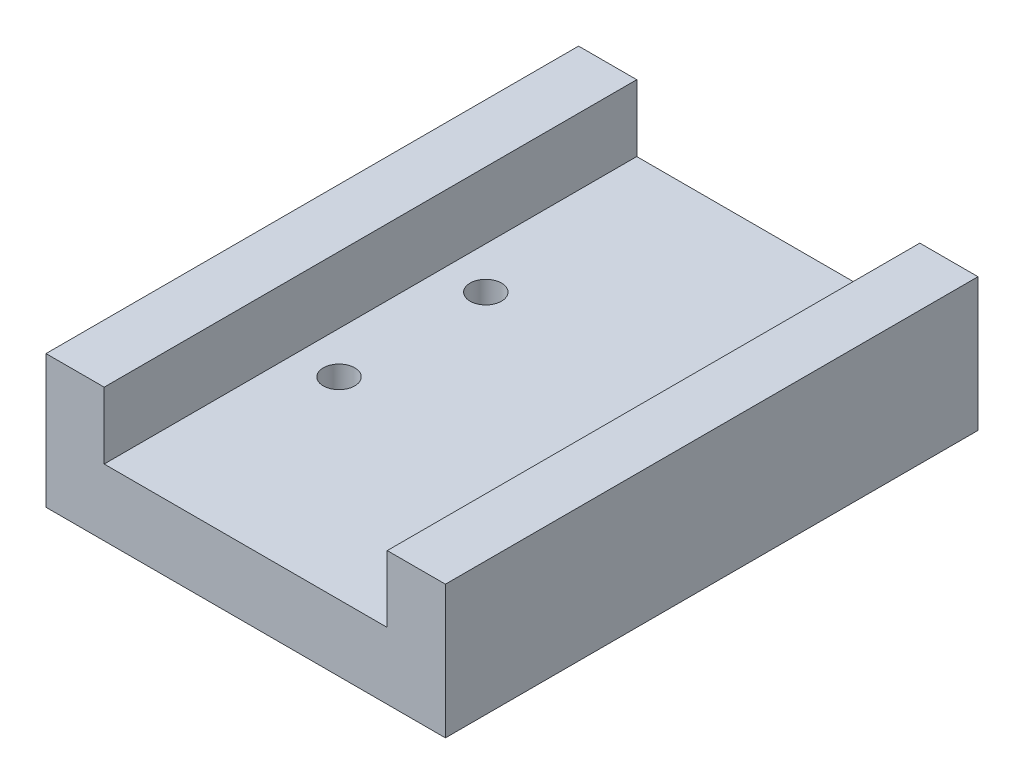
ISO-10303-21;
HEADER;
FILE_DESCRIPTION(('STEP AP214'),'2;1');
FILE_NAME('part.step','',(''),(''),'','','');
FILE_SCHEMA(('AUTOMOTIVE_DESIGN { 1 0 10303 214 1 1 1 1 }'));
ENDSEC;
DATA;
#1=APPLICATION_CONTEXT('core data for automotive mechanical design processes');
#2=APPLICATION_PROTOCOL_DEFINITION('international standard','automotive_design',2000,#1);
#3=PRODUCT_CONTEXT('',#1,'mechanical');
#4=PRODUCT('Part','Part','',(#3));
#5=PRODUCT_RELATED_PRODUCT_CATEGORY('part','',(#4));
#6=PRODUCT_DEFINITION_FORMATION('','',#4);
#7=PRODUCT_DEFINITION_CONTEXT('part definition',#1,'design');
#8=PRODUCT_DEFINITION('design','',#6,#7);
#9=PRODUCT_DEFINITION_SHAPE('','',#8);
#10=(LENGTH_UNIT() NAMED_UNIT(*) SI_UNIT(.MILLI.,.METRE.));
#11=(NAMED_UNIT(*) PLANE_ANGLE_UNIT() SI_UNIT($,.RADIAN.));
#12=(NAMED_UNIT(*) SI_UNIT($,.STERADIAN.) SOLID_ANGLE_UNIT());
#13=UNCERTAINTY_MEASURE_WITH_UNIT(LENGTH_MEASURE(1.E-05),#10,'distance_accuracy_value','');
#14=(GEOMETRIC_REPRESENTATION_CONTEXT(3) GLOBAL_UNCERTAINTY_ASSIGNED_CONTEXT((#13)) GLOBAL_UNIT_ASSIGNED_CONTEXT((#10,
#11,#12)) REPRESENTATION_CONTEXT('',''));
#15=CARTESIAN_POINT('',(0.,0.,0.));
#16=DIRECTION('',(0.,0.,1.));
#17=DIRECTION('',(1.,0.,0.));
#18=AXIS2_PLACEMENT_3D('',#15,#16,#17);
#19=CARTESIAN_POINT('',(0.,0.,50.8));
#20=DIRECTION('',(0.,1.,0.));
#21=DIRECTION('',(0.,0.,1.));
#22=AXIS2_PLACEMENT_3D('',#19,#20,#21);
#23=PLANE('',#22);
#24=DIRECTION('',(1.,0.,0.));
#25=VECTOR('',#24,1.);
#26=CARTESIAN_POINT('',(0.,0.,0.));
#27=LINE('',#26,#25);
#28=CARTESIAN_POINT('',(-19.05,0.,0.));
#29=VERTEX_POINT('',#28);
#30=CARTESIAN_POINT('',(19.05,0.,0.));
#31=VERTEX_POINT('',#30);
#32=EDGE_CURVE('E136',#29,#31,#27,.T.);
#33=ORIENTED_EDGE('',*,*,#32,.T.);
#34=DIRECTION('',(0.,0.,-1.));
#35=VECTOR('',#34,1.);
#36=CARTESIAN_POINT('',(19.05,0.,50.8));
#37=LINE('',#36,#35);
#38=CARTESIAN_POINT('',(19.05,0.,50.8));
#39=VERTEX_POINT('',#38);
#40=EDGE_CURVE('E45',#39,#31,#37,.T.);
#41=ORIENTED_EDGE('',*,*,#40,.F.);
#42=DIRECTION('',(1.,0.,0.));
#43=VECTOR('',#42,1.);
#44=CARTESIAN_POINT('',(0.,0.,50.8));
#45=LINE('',#44,#43);
#46=CARTESIAN_POINT('',(-19.05,0.,50.8));
#47=VERTEX_POINT('',#46);
#48=EDGE_CURVE('E177',#47,#39,#45,.T.);
#49=ORIENTED_EDGE('',*,*,#48,.F.);
#50=DIRECTION('',(0.,0.,-1.));
#51=VECTOR('',#50,1.);
#52=CARTESIAN_POINT('',(-19.05,0.,50.8));
#53=LINE('',#52,#51);
#54=EDGE_CURVE('E11',#47,#29,#53,.T.);
#55=ORIENTED_EDGE('',*,*,#54,.T.);
#56=EDGE_LOOP('',(#33,#41,#49,#55));
#57=FACE_BOUND('',#56,.T.);
#58=CARTESIAN_POINT('',(-9.5,0.,18.4));
#59=DIRECTION('',(0.,1.,0.));
#60=DIRECTION('',(0.,0.,1.));
#61=AXIS2_PLACEMENT_3D('',#58,#59,#60);
#62=CIRCLE('',#61,1.5);
#63=CARTESIAN_POINT('',(-9.5,0.,19.9));
#64=VERTEX_POINT('',#63);
#65=EDGE_CURVE('E169',#64,#64,#62,.T.);
#66=ORIENTED_EDGE('',*,*,#65,.T.);
#67=EDGE_LOOP('',(#66));
#68=FACE_BOUND('',#67,.T.);
#69=CARTESIAN_POINT('',(-9.5,0.,32.4));
#70=DIRECTION('',(0.,1.,0.));
#71=DIRECTION('',(0.,0.,1.));
#72=AXIS2_PLACEMENT_3D('',#69,#70,#71);
#73=CIRCLE('',#72,1.5);
#74=CARTESIAN_POINT('',(-9.5,0.,33.9));
#75=VERTEX_POINT('',#74);
#76=EDGE_CURVE('E164',#75,#75,#73,.F.);
#77=ORIENTED_EDGE('',*,*,#76,.F.);
#78=EDGE_LOOP('',(#77));
#79=FACE_BOUND('',#78,.T.);
#80=ADVANCED_FACE('F35',(#57,#68,#79),#23,.F.);
#81=CARTESIAN_POINT('',(0.,6.35,50.8));
#82=DIRECTION('',(0.,1.,0.));
#83=DIRECTION('',(0.,0.,1.));
#84=AXIS2_PLACEMENT_3D('',#81,#82,#83);
#85=PLANE('',#84);
#86=CARTESIAN_POINT('',(-9.5,6.35,18.4));
#87=DIRECTION('',(0.,1.,0.));
#88=DIRECTION('',(0.,0.,1.));
#89=AXIS2_PLACEMENT_3D('',#86,#87,#88);
#90=CIRCLE('',#89,1.5);
#91=CARTESIAN_POINT('',(-9.5,6.35,19.9));
#92=VERTEX_POINT('',#91);
#93=EDGE_CURVE('E162',#92,#92,#90,.F.);
#94=ORIENTED_EDGE('',*,*,#93,.T.);
#95=EDGE_LOOP('',(#94));
#96=FACE_BOUND('',#95,.T.);
#97=DIRECTION('',(1.,0.,0.));
#98=VECTOR('',#97,1.);
#99=CARTESIAN_POINT('',(0.,6.35,0.));
#100=LINE('',#99,#98);
#101=CARTESIAN_POINT('',(-13.5,6.35,0.));
#102=VERTEX_POINT('',#101);
#103=CARTESIAN_POINT('',(13.5,6.35,0.));
#104=VERTEX_POINT('',#103);
#105=EDGE_CURVE('E112',#102,#104,#100,.T.);
#106=ORIENTED_EDGE('',*,*,#105,.F.);
#107=DIRECTION('',(0.,0.,-1.));
#108=VECTOR('',#107,1.);
#109=CARTESIAN_POINT('',(-13.5,6.35,50.8));
#110=LINE('',#109,#108);
#111=CARTESIAN_POINT('',(-13.5,6.35,50.8));
#112=VERTEX_POINT('',#111);
#113=EDGE_CURVE('E105',#112,#102,#110,.T.);
#114=ORIENTED_EDGE('',*,*,#113,.F.);
#115=DIRECTION('',(1.,0.,0.));
#116=VECTOR('',#115,1.);
#117=CARTESIAN_POINT('',(0.,6.35,50.8));
#118=LINE('',#117,#116);
#119=CARTESIAN_POINT('',(13.5,6.35,50.8));
#120=VERTEX_POINT('',#119);
#121=EDGE_CURVE('E110',#112,#120,#118,.T.);
#122=ORIENTED_EDGE('',*,*,#121,.T.);
#123=DIRECTION('',(0.,0.,-1.));
#124=VECTOR('',#123,1.);
#125=CARTESIAN_POINT('',(13.5,6.35,50.8));
#126=LINE('',#125,#124);
#127=EDGE_CURVE('E115',#120,#104,#126,.T.);
#128=ORIENTED_EDGE('',*,*,#127,.T.);
#129=EDGE_LOOP('',(#106,#114,#122,#128));
#130=FACE_BOUND('',#129,.T.);
#131=CARTESIAN_POINT('',(-9.5,6.35,32.4));
#132=DIRECTION('',(0.,1.,0.));
#133=DIRECTION('',(0.,0.,1.));
#134=AXIS2_PLACEMENT_3D('',#131,#132,#133);
#135=CIRCLE('',#134,1.5);
#136=CARTESIAN_POINT('',(-9.5,6.35,33.9));
#137=VERTEX_POINT('',#136);
#138=EDGE_CURVE('E39',#137,#137,#135,.T.);
#139=ORIENTED_EDGE('',*,*,#138,.F.);
#140=EDGE_LOOP('',(#139));
#141=FACE_BOUND('',#140,.T.);
#142=ADVANCED_FACE('F107',(#96,#130,#141),#85,.T.);
#143=CARTESIAN_POINT('',(-19.05,0.,50.8));
#144=DIRECTION('',(-1.,0.,0.));
#145=DIRECTION('',(0.,-1.,0.));
#146=AXIS2_PLACEMENT_3D('',#143,#144,#145);
#147=PLANE('',#146);
#148=DIRECTION('',(0.,1.,0.));
#149=VECTOR('',#148,1.);
#150=CARTESIAN_POINT('',(-19.05,0.,0.));
#151=LINE('',#150,#149);
#152=CARTESIAN_POINT('',(-19.05,12.7,0.));
#153=VERTEX_POINT('',#152);
#154=EDGE_CURVE('E134',#29,#153,#151,.T.);
#155=ORIENTED_EDGE('',*,*,#154,.F.);
#156=ORIENTED_EDGE('',*,*,#54,.F.);
#157=DIRECTION('',(0.,1.,0.));
#158=VECTOR('',#157,1.);
#159=CARTESIAN_POINT('',(-19.05,0.,50.8));
#160=LINE('',#159,#158);
#161=CARTESIAN_POINT('',(-19.05,12.7,50.8));
#162=VERTEX_POINT('',#161);
#163=EDGE_CURVE('E154',#47,#162,#160,.T.);
#164=ORIENTED_EDGE('',*,*,#163,.T.);
#165=DIRECTION('',(0.,0.,-1.));
#166=VECTOR('',#165,1.);
#167=CARTESIAN_POINT('',(-19.05,12.7,50.8));
#168=LINE('',#167,#166);
#169=EDGE_CURVE('E54',#162,#153,#168,.T.);
#170=ORIENTED_EDGE('',*,*,#169,.T.);
#171=EDGE_LOOP('',(#155,#156,#164,#170));
#172=FACE_BOUND('',#171,.T.);
#173=ADVANCED_FACE('F37',(#172),#147,.T.);
#174=CARTESIAN_POINT('',(19.05,0.,50.8));
#175=DIRECTION('',(1.,0.,0.));
#176=DIRECTION('',(0.,0.,-1.));
#177=AXIS2_PLACEMENT_3D('',#174,#175,#176);
#178=PLANE('',#177);
#179=DIRECTION('',(0.,-1.,0.));
#180=VECTOR('',#179,1.);
#181=CARTESIAN_POINT('',(19.05,0.,0.));
#182=LINE('',#181,#180);
#183=CARTESIAN_POINT('',(19.05,12.7,0.));
#184=VERTEX_POINT('',#183);
#185=EDGE_CURVE('E139',#184,#31,#182,.T.);
#186=ORIENTED_EDGE('',*,*,#185,.F.);
#187=DIRECTION('',(0.,0.,-1.));
#188=VECTOR('',#187,1.);
#189=CARTESIAN_POINT('',(19.05,12.7,50.8));
#190=LINE('',#189,#188);
#191=CARTESIAN_POINT('',(19.05,12.7,50.8));
#192=VERTEX_POINT('',#191);
#193=EDGE_CURVE('E160',#192,#184,#190,.T.);
#194=ORIENTED_EDGE('',*,*,#193,.F.);
#195=DIRECTION('',(0.,-1.,0.));
#196=VECTOR('',#195,1.);
#197=CARTESIAN_POINT('',(19.05,0.,50.8));
#198=LINE('',#197,#196);
#199=EDGE_CURVE('E179',#192,#39,#198,.T.);
#200=ORIENTED_EDGE('',*,*,#199,.T.);
#201=ORIENTED_EDGE('',*,*,#40,.T.);
#202=EDGE_LOOP('',(#186,#194,#200,#201));
#203=FACE_BOUND('',#202,.T.);
#204=ADVANCED_FACE('F211',(#203),#178,.T.);
#205=CARTESIAN_POINT('',(0.,12.7,50.8));
#206=DIRECTION('',(0.,-1.,0.));
#207=DIRECTION('',(0.,0.,-1.));
#208=AXIS2_PLACEMENT_3D('',#205,#206,#207);
#209=PLANE('',#208);
#210=DIRECTION('',(-1.,0.,0.));
#211=VECTOR('',#210,1.);
#212=CARTESIAN_POINT('',(0.,12.7,0.));
#213=LINE('',#212,#211);
#214=CARTESIAN_POINT('',(13.5,12.7,0.));
#215=VERTEX_POINT('',#214);
#216=EDGE_CURVE('E142',#184,#215,#213,.T.);
#217=ORIENTED_EDGE('',*,*,#216,.T.);
#218=DIRECTION('',(0.,0.,-1.));
#219=VECTOR('',#218,1.);
#220=CARTESIAN_POINT('',(13.5,12.7,50.8));
#221=LINE('',#220,#219);
#222=CARTESIAN_POINT('',(13.5,12.7,50.8));
#223=VERTEX_POINT('',#222);
#224=EDGE_CURVE('E158',#223,#215,#221,.T.);
#225=ORIENTED_EDGE('',*,*,#224,.F.);
#226=DIRECTION('',(-1.,0.,0.));
#227=VECTOR('',#226,1.);
#228=CARTESIAN_POINT('',(0.,12.7,50.8));
#229=LINE('',#228,#227);
#230=EDGE_CURVE('E129',#192,#223,#229,.T.);
#231=ORIENTED_EDGE('',*,*,#230,.F.);
#232=ORIENTED_EDGE('',*,*,#193,.T.);
#233=EDGE_LOOP('',(#217,#225,#231,#232));
#234=FACE_BOUND('',#233,.T.);
#235=ADVANCED_FACE('F185',(#234),#209,.F.);
#236=CARTESIAN_POINT('',(13.5,0.,50.8));
#237=DIRECTION('',(-1.,0.,0.));
#238=DIRECTION('',(0.,0.,1.));
#239=AXIS2_PLACEMENT_3D('',#236,#237,#238);
#240=PLANE('',#239);
#241=DIRECTION('',(0.,1.,0.));
#242=VECTOR('',#241,1.);
#243=CARTESIAN_POINT('',(13.5,0.,0.));
#244=LINE('',#243,#242);
#245=EDGE_CURVE('E145',#104,#215,#244,.T.);
#246=ORIENTED_EDGE('',*,*,#245,.F.);
#247=ORIENTED_EDGE('',*,*,#127,.F.);
#248=DIRECTION('',(0.,1.,0.));
#249=VECTOR('',#248,1.);
#250=CARTESIAN_POINT('',(13.5,0.,50.8));
#251=LINE('',#250,#249);
#252=EDGE_CURVE('E127',#120,#223,#251,.T.);
#253=ORIENTED_EDGE('',*,*,#252,.T.);
#254=ORIENTED_EDGE('',*,*,#224,.T.);
#255=EDGE_LOOP('',(#246,#247,#253,#254));
#256=FACE_BOUND('',#255,.T.);
#257=ADVANCED_FACE('F189',(#256),#240,.T.);
#258=CARTESIAN_POINT('',(-13.5,0.,50.8));
#259=DIRECTION('',(-1.,0.,0.));
#260=DIRECTION('',(0.,0.,1.));
#261=AXIS2_PLACEMENT_3D('',#258,#259,#260);
#262=PLANE('',#261);
#263=DIRECTION('',(0.,1.,0.));
#264=VECTOR('',#263,1.);
#265=CARTESIAN_POINT('',(-13.5,0.,0.));
#266=LINE('',#265,#264);
#267=CARTESIAN_POINT('',(-13.5,12.7,0.));
#268=VERTEX_POINT('',#267);
#269=EDGE_CURVE('E149',#102,#268,#266,.T.);
#270=ORIENTED_EDGE('',*,*,#269,.T.);
#271=DIRECTION('',(0.,0.,-1.));
#272=VECTOR('',#271,1.);
#273=CARTESIAN_POINT('',(-13.5,12.7,50.8));
#274=LINE('',#273,#272);
#275=CARTESIAN_POINT('',(-13.5,12.7,50.8));
#276=VERTEX_POINT('',#275);
#277=EDGE_CURVE('E80',#276,#268,#274,.T.);
#278=ORIENTED_EDGE('',*,*,#277,.F.);
#279=DIRECTION('',(0.,1.,0.));
#280=VECTOR('',#279,1.);
#281=CARTESIAN_POINT('',(-13.5,0.,50.8));
#282=LINE('',#281,#280);
#283=EDGE_CURVE('E117',#112,#276,#282,.T.);
#284=ORIENTED_EDGE('',*,*,#283,.F.);
#285=ORIENTED_EDGE('',*,*,#113,.T.);
#286=EDGE_LOOP('',(#270,#278,#284,#285));
#287=FACE_BOUND('',#286,.T.);
#288=ADVANCED_FACE('F118',(#287),#262,.F.);
#289=CARTESIAN_POINT('',(0.,12.7,50.8));
#290=DIRECTION('',(0.,1.,0.));
#291=DIRECTION('',(0.,0.,1.));
#292=AXIS2_PLACEMENT_3D('',#289,#290,#291);
#293=PLANE('',#292);
#294=DIRECTION('',(1.,0.,0.));
#295=VECTOR('',#294,1.);
#296=CARTESIAN_POINT('',(0.,12.7,0.));
#297=LINE('',#296,#295);
#298=EDGE_CURVE('E151',#153,#268,#297,.T.);
#299=ORIENTED_EDGE('',*,*,#298,.F.);
#300=ORIENTED_EDGE('',*,*,#169,.F.);
#301=DIRECTION('',(1.,0.,0.));
#302=VECTOR('',#301,1.);
#303=CARTESIAN_POINT('',(0.,12.7,50.8));
#304=LINE('',#303,#302);
#305=EDGE_CURVE('E121',#162,#276,#304,.T.);
#306=ORIENTED_EDGE('',*,*,#305,.T.);
#307=ORIENTED_EDGE('',*,*,#277,.T.);
#308=EDGE_LOOP('',(#299,#300,#306,#307));
#309=FACE_BOUND('',#308,.T.);
#310=ADVANCED_FACE('F193',(#309),#293,.T.);
#311=CARTESIAN_POINT('',(0.,0.,50.8));
#312=DIRECTION('',(0.,0.,1.));
#313=DIRECTION('',(1.,0.,0.));
#314=AXIS2_PLACEMENT_3D('',#311,#312,#313);
#315=PLANE('',#314);
#316=ORIENTED_EDGE('',*,*,#163,.F.);
#317=ORIENTED_EDGE('',*,*,#48,.T.);
#318=ORIENTED_EDGE('',*,*,#199,.F.);
#319=ORIENTED_EDGE('',*,*,#230,.T.);
#320=ORIENTED_EDGE('',*,*,#252,.F.);
#321=ORIENTED_EDGE('',*,*,#121,.F.);
#322=ORIENTED_EDGE('',*,*,#283,.T.);
#323=ORIENTED_EDGE('',*,*,#305,.F.);
#324=EDGE_LOOP('',(#316,#317,#318,#319,#320,#321,#322,#323));
#325=FACE_BOUND('',#324,.T.);
#326=ADVANCED_FACE('F125',(#325),#315,.T.);
#327=CARTESIAN_POINT('',(0.,0.,0.));
#328=DIRECTION('',(0.,0.,1.));
#329=DIRECTION('',(1.,0.,0.));
#330=AXIS2_PLACEMENT_3D('',#327,#328,#329);
#331=PLANE('',#330);
#332=ORIENTED_EDGE('',*,*,#154,.T.);
#333=ORIENTED_EDGE('',*,*,#298,.T.);
#334=ORIENTED_EDGE('',*,*,#269,.F.);
#335=ORIENTED_EDGE('',*,*,#105,.T.);
#336=ORIENTED_EDGE('',*,*,#245,.T.);
#337=ORIENTED_EDGE('',*,*,#216,.F.);
#338=ORIENTED_EDGE('',*,*,#185,.T.);
#339=ORIENTED_EDGE('',*,*,#32,.F.);
#340=EDGE_LOOP('',(#332,#333,#334,#335,#336,#337,#338,#339));
#341=FACE_BOUND('',#340,.T.);
#342=ADVANCED_FACE('F191',(#341),#331,.F.);
#343=CARTESIAN_POINT('',(-9.5,12.7,18.4));
#344=DIRECTION('',(0.,-1.,0.));
#345=DIRECTION('',(0.,0.,-1.));
#346=AXIS2_PLACEMENT_3D('',#343,#344,#345);
#347=CYLINDRICAL_SURFACE('',#346,1.5);
#348=ORIENTED_EDGE('',*,*,#93,.F.);
#349=EDGE_LOOP('',(#348));
#350=FACE_BOUND('',#349,.T.);
#351=ORIENTED_EDGE('',*,*,#65,.F.);
#352=EDGE_LOOP('',(#351));
#353=FACE_BOUND('',#352,.T.);
#354=ADVANCED_FACE('F247',(#350,#353),#347,.F.);
#355=CARTESIAN_POINT('',(-9.5,12.7,32.4));
#356=DIRECTION('',(0.,-1.,0.));
#357=DIRECTION('',(0.,0.,-1.));
#358=AXIS2_PLACEMENT_3D('',#355,#356,#357);
#359=CYLINDRICAL_SURFACE('',#358,1.5);
#360=ORIENTED_EDGE('',*,*,#138,.T.);
#361=EDGE_LOOP('',(#360));
#362=FACE_BOUND('',#361,.T.);
#363=ORIENTED_EDGE('',*,*,#76,.T.);
#364=EDGE_LOOP('',(#363));
#365=FACE_BOUND('',#364,.T.);
#366=ADVANCED_FACE('F270',(#362,#365),#359,.F.);
#367=CLOSED_SHELL('',(#80,#142,#173,#204,#235,#257,#288,#310,#326,#342,#354,#366));
#368=MANIFOLD_SOLID_BREP('B2',#367);
#369=ADVANCED_BREP_SHAPE_REPRESENTATION('',(#18,#368),#14);
#370=SHAPE_DEFINITION_REPRESENTATION(#9,#369);
ENDSEC;
END-ISO-10303-21;
